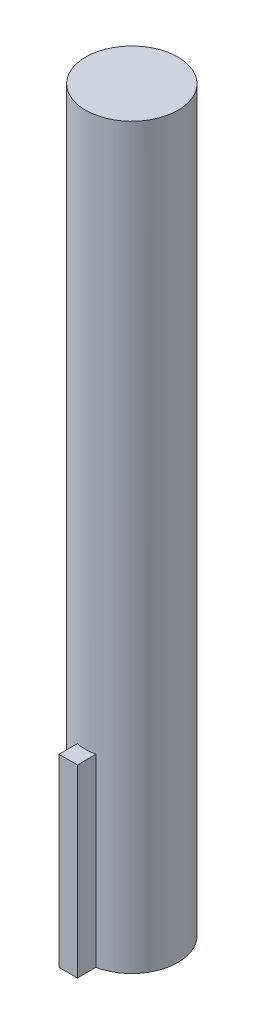
ISO-10303-21;
HEADER;
FILE_DESCRIPTION(('STEP AP214'),'2;1');
FILE_NAME('part.step','',(''),(''),'','','');
FILE_SCHEMA(('AUTOMOTIVE_DESIGN { 1 0 10303 214 1 1 1 1 }'));
ENDSEC;
DATA;
#1=APPLICATION_CONTEXT('core data for automotive mechanical design processes');
#2=APPLICATION_PROTOCOL_DEFINITION('international standard','automotive_design',2000,#1);
#3=PRODUCT_CONTEXT('',#1,'mechanical');
#4=PRODUCT('Part','Part','',(#3));
#5=PRODUCT_RELATED_PRODUCT_CATEGORY('part','',(#4));
#6=PRODUCT_DEFINITION_FORMATION('','',#4);
#7=PRODUCT_DEFINITION_CONTEXT('part definition',#1,'design');
#8=PRODUCT_DEFINITION('design','',#6,#7);
#9=PRODUCT_DEFINITION_SHAPE('','',#8);
#10=(LENGTH_UNIT() NAMED_UNIT(*) SI_UNIT(.MILLI.,.METRE.));
#11=(NAMED_UNIT(*) PLANE_ANGLE_UNIT() SI_UNIT($,.RADIAN.));
#12=(NAMED_UNIT(*) SI_UNIT($,.STERADIAN.) SOLID_ANGLE_UNIT());
#13=UNCERTAINTY_MEASURE_WITH_UNIT(LENGTH_MEASURE(1.E-05),#10,'distance_accuracy_value','');
#14=(GEOMETRIC_REPRESENTATION_CONTEXT(3) GLOBAL_UNCERTAINTY_ASSIGNED_CONTEXT((#13)) GLOBAL_UNIT_ASSIGNED_CONTEXT((#10,
#11,#12)) REPRESENTATION_CONTEXT('',''));
#15=CARTESIAN_POINT('',(0.,0.,0.));
#16=DIRECTION('',(0.,0.,1.));
#17=DIRECTION('',(1.,0.,0.));
#18=AXIS2_PLACEMENT_3D('',#15,#16,#17);
#19=CARTESIAN_POINT('',(0.,10.,0.));
#20=DIRECTION('',(0.,-1.,0.));
#21=DIRECTION('',(0.,0.,-1.));
#22=AXIS2_PLACEMENT_3D('',#19,#20,#21);
#23=CYLINDRICAL_SURFACE('',#22,2.5);
#24=CARTESIAN_POINT('',(0.,0.,0.));
#25=DIRECTION('',(0.,1.,0.));
#26=DIRECTION('',(0.,0.,1.));
#27=AXIS2_PLACEMENT_3D('',#24,#25,#26);
#28=CIRCLE('',#27,2.5);
#29=CARTESIAN_POINT('',(0.5,0.,2.44948974278318));
#30=VERTEX_POINT('',#29);
#31=CARTESIAN_POINT('',(-0.5,0.,2.44948974278318));
#32=VERTEX_POINT('',#31);
#33=EDGE_CURVE('E96',#30,#32,#28,.T.);
#34=ORIENTED_EDGE('',*,*,#33,.T.);
#35=DIRECTION('',(0.,-1.,0.));
#36=VECTOR('',#35,1.);
#37=CARTESIAN_POINT('',(-0.5,10.,2.44948974278318));
#38=LINE('',#37,#36);
#39=CARTESIAN_POINT('',(-0.5,10.,2.44948974278318));
#40=VERTEX_POINT('',#39);
#41=EDGE_CURVE('E40',#40,#32,#38,.T.);
#42=ORIENTED_EDGE('',*,*,#41,.F.);
#43=CARTESIAN_POINT('',(0.,10.,0.));
#44=DIRECTION('',(0.,1.,0.));
#45=DIRECTION('',(0.,0.,1.));
#46=AXIS2_PLACEMENT_3D('',#43,#44,#45);
#47=CIRCLE('',#46,2.5);
#48=CARTESIAN_POINT('',(0.5,10.,2.44948974278318));
#49=VERTEX_POINT('',#48);
#50=EDGE_CURVE('E11',#40,#49,#47,.T.);
#51=ORIENTED_EDGE('',*,*,#50,.T.);
#52=DIRECTION('',(0.,-1.,0.));
#53=VECTOR('',#52,1.);
#54=CARTESIAN_POINT('',(0.5,10.,2.44948974278318));
#55=LINE('',#54,#53);
#56=EDGE_CURVE('E83',#49,#30,#55,.T.);
#57=ORIENTED_EDGE('',*,*,#56,.T.);
#58=EDGE_LOOP('',(#34,#42,#51,#57));
#59=FACE_BOUND('',#58,.T.);
#60=CARTESIAN_POINT('',(0.,40.,0.));
#61=DIRECTION('',(0.,1.,0.));
#62=DIRECTION('',(0.,0.,1.));
#63=AXIS2_PLACEMENT_3D('',#60,#61,#62);
#64=CIRCLE('',#63,2.5);
#65=CARTESIAN_POINT('',(0.,40.,2.5));
#66=VERTEX_POINT('',#65);
#67=EDGE_CURVE('E107',#66,#66,#64,.T.);
#68=ORIENTED_EDGE('',*,*,#67,.F.);
#69=EDGE_LOOP('',(#68));
#70=FACE_BOUND('',#69,.T.);
#71=ADVANCED_FACE('F37',(#59,#70),#23,.T.);
#72=CARTESIAN_POINT('',(-0.5,10.,2.44948974278318));
#73=DIRECTION('',(1.,0.,0.));
#74=DIRECTION('',(0.,0.,-1.));
#75=AXIS2_PLACEMENT_3D('',#72,#73,#74);
#76=PLANE('',#75);
#77=DIRECTION('',(0.,0.,1.));
#78=VECTOR('',#77,1.);
#79=CARTESIAN_POINT('',(-0.5,0.,2.44948974278318));
#80=LINE('',#79,#78);
#81=CARTESIAN_POINT('',(-0.5,0.,3.44948974278318));
#82=VERTEX_POINT('',#81);
#83=EDGE_CURVE('E105',#32,#82,#80,.T.);
#84=ORIENTED_EDGE('',*,*,#83,.T.);
#85=DIRECTION('',(0.,-1.,0.));
#86=VECTOR('',#85,1.);
#87=CARTESIAN_POINT('',(-0.5,10.,3.44948974278318));
#88=LINE('',#87,#86);
#89=CARTESIAN_POINT('',(-0.5,10.,3.44948974278318));
#90=VERTEX_POINT('',#89);
#91=EDGE_CURVE('E98',#90,#82,#88,.T.);
#92=ORIENTED_EDGE('',*,*,#91,.F.);
#93=DIRECTION('',(0.,0.,1.));
#94=VECTOR('',#93,1.);
#95=CARTESIAN_POINT('',(-0.5,10.,2.44948974278318));
#96=LINE('',#95,#94);
#97=EDGE_CURVE('E103',#40,#90,#96,.T.);
#98=ORIENTED_EDGE('',*,*,#97,.F.);
#99=ORIENTED_EDGE('',*,*,#41,.T.);
#100=EDGE_LOOP('',(#84,#92,#98,#99));
#101=FACE_BOUND('',#100,.T.);
#102=ADVANCED_FACE('F116',(#101),#76,.F.);
#103=CARTESIAN_POINT('',(-0.5,10.,3.44948974278318));
#104=DIRECTION('',(0.,0.,-1.));
#105=DIRECTION('',(-1.,0.,0.));
#106=AXIS2_PLACEMENT_3D('',#103,#104,#105);
#107=PLANE('',#106);
#108=DIRECTION('',(1.,0.,0.));
#109=VECTOR('',#108,1.);
#110=CARTESIAN_POINT('',(-0.5,0.,3.44948974278318));
#111=LINE('',#110,#109);
#112=CARTESIAN_POINT('',(0.5,0.,3.44948974278318));
#113=VERTEX_POINT('',#112);
#114=EDGE_CURVE('E71',#82,#113,#111,.T.);
#115=ORIENTED_EDGE('',*,*,#114,.T.);
#116=DIRECTION('',(0.,-1.,0.));
#117=VECTOR('',#116,1.);
#118=CARTESIAN_POINT('',(0.5,10.,3.44948974278318));
#119=LINE('',#118,#117);
#120=CARTESIAN_POINT('',(0.5,10.,3.44948974278318));
#121=VERTEX_POINT('',#120);
#122=EDGE_CURVE('E89',#121,#113,#119,.T.);
#123=ORIENTED_EDGE('',*,*,#122,.F.);
#124=DIRECTION('',(1.,0.,0.));
#125=VECTOR('',#124,1.);
#126=CARTESIAN_POINT('',(-0.5,10.,3.44948974278318));
#127=LINE('',#126,#125);
#128=EDGE_CURVE('E54',#90,#121,#127,.T.);
#129=ORIENTED_EDGE('',*,*,#128,.F.);
#130=ORIENTED_EDGE('',*,*,#91,.T.);
#131=EDGE_LOOP('',(#115,#123,#129,#130));
#132=FACE_BOUND('',#131,.T.);
#133=ADVANCED_FACE('F120',(#132),#107,.F.);
#134=CARTESIAN_POINT('',(0.5,10.,3.44948974278318));
#135=DIRECTION('',(-1.,0.,0.));
#136=DIRECTION('',(0.,0.,1.));
#137=AXIS2_PLACEMENT_3D('',#134,#135,#136);
#138=PLANE('',#137);
#139=DIRECTION('',(0.,0.,-1.));
#140=VECTOR('',#139,1.);
#141=CARTESIAN_POINT('',(0.5,0.,3.44948974278318));
#142=LINE('',#141,#140);
#143=EDGE_CURVE('E77',#113,#30,#142,.T.);
#144=ORIENTED_EDGE('',*,*,#143,.T.);
#145=ORIENTED_EDGE('',*,*,#56,.F.);
#146=DIRECTION('',(0.,0.,-1.));
#147=VECTOR('',#146,1.);
#148=CARTESIAN_POINT('',(0.5,10.,3.44948974278318));
#149=LINE('',#148,#147);
#150=EDGE_CURVE('E85',#121,#49,#149,.T.);
#151=ORIENTED_EDGE('',*,*,#150,.F.);
#152=ORIENTED_EDGE('',*,*,#122,.T.);
#153=EDGE_LOOP('',(#144,#145,#151,#152));
#154=FACE_BOUND('',#153,.T.);
#155=ADVANCED_FACE('F84',(#154),#138,.F.);
#156=CARTESIAN_POINT('',(0.,10.,0.));
#157=DIRECTION('',(0.,1.,0.));
#158=DIRECTION('',(0.,0.,1.));
#159=AXIS2_PLACEMENT_3D('',#156,#157,#158);
#160=PLANE('',#159);
#161=ORIENTED_EDGE('',*,*,#50,.F.);
#162=ORIENTED_EDGE('',*,*,#97,.T.);
#163=ORIENTED_EDGE('',*,*,#128,.T.);
#164=ORIENTED_EDGE('',*,*,#150,.T.);
#165=EDGE_LOOP('',(#161,#162,#163,#164));
#166=FACE_BOUND('',#165,.T.);
#167=ADVANCED_FACE('F91',(#166),#160,.T.);
#168=CARTESIAN_POINT('',(0.,0.,0.));
#169=DIRECTION('',(0.,1.,0.));
#170=DIRECTION('',(0.,0.,1.));
#171=AXIS2_PLACEMENT_3D('',#168,#169,#170);
#172=PLANE('',#171);
#173=ORIENTED_EDGE('',*,*,#33,.F.);
#174=ORIENTED_EDGE('',*,*,#143,.F.);
#175=ORIENTED_EDGE('',*,*,#114,.F.);
#176=ORIENTED_EDGE('',*,*,#83,.F.);
#177=EDGE_LOOP('',(#173,#174,#175,#176));
#178=FACE_BOUND('',#177,.T.);
#179=ADVANCED_FACE('F128',(#178),#172,.F.);
#180=CARTESIAN_POINT('',(0.,40.,0.));
#181=DIRECTION('',(0.,1.,0.));
#182=DIRECTION('',(0.,0.,1.));
#183=AXIS2_PLACEMENT_3D('',#180,#181,#182);
#184=PLANE('',#183);
#185=ORIENTED_EDGE('',*,*,#67,.T.);
#186=EDGE_LOOP('',(#185));
#187=FACE_BOUND('',#186,.T.);
#188=ADVANCED_FACE('F114',(#187),#184,.T.);
#189=CLOSED_SHELL('',(#71,#102,#133,#155,#167,#179,#188));
#190=MANIFOLD_SOLID_BREP('B2',#189);
#191=ADVANCED_BREP_SHAPE_REPRESENTATION('',(#18,#190),#14);
#192=SHAPE_DEFINITION_REPRESENTATION(#9,#191);
ENDSEC;
END-ISO-10303-21;
